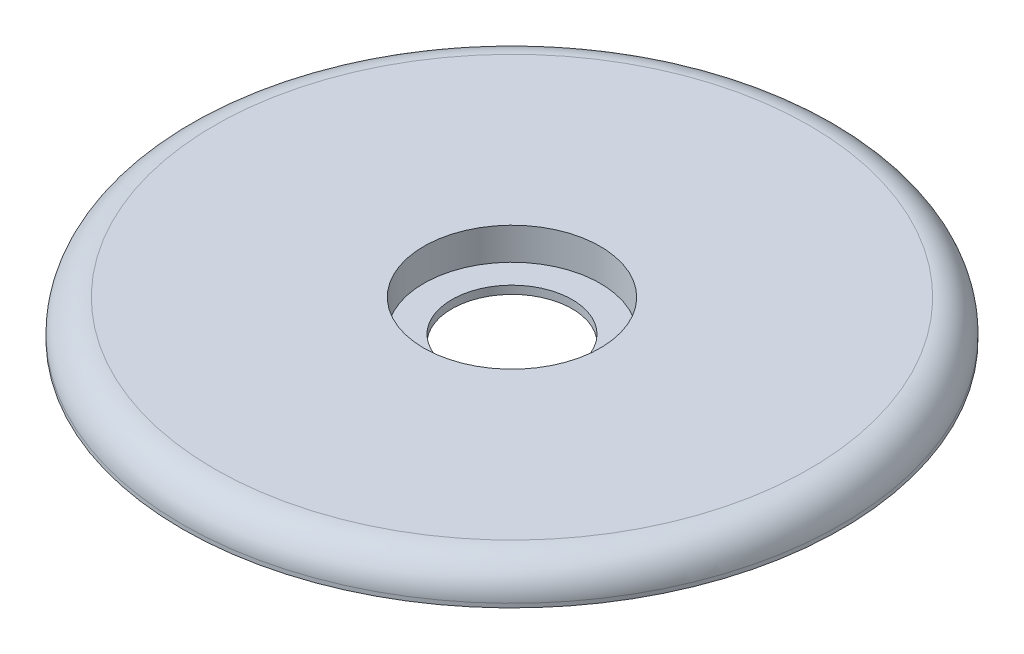
ISO-10303-21;
HEADER;
FILE_DESCRIPTION(('STEP AP214'),'2;1');
FILE_NAME('part.step','',(''),(''),'','','');
FILE_SCHEMA(('AUTOMOTIVE_DESIGN { 1 0 10303 214 1 1 1 1 }'));
ENDSEC;
DATA;
#1=APPLICATION_CONTEXT('core data for automotive mechanical design processes');
#2=APPLICATION_PROTOCOL_DEFINITION('international standard','automotive_design',2000,#1);
#3=PRODUCT_CONTEXT('',#1,'mechanical');
#4=PRODUCT('Part','Part','',(#3));
#5=PRODUCT_RELATED_PRODUCT_CATEGORY('part','',(#4));
#6=PRODUCT_DEFINITION_FORMATION('','',#4);
#7=PRODUCT_DEFINITION_CONTEXT('part definition',#1,'design');
#8=PRODUCT_DEFINITION('design','',#6,#7);
#9=PRODUCT_DEFINITION_SHAPE('','',#8);
#10=(LENGTH_UNIT() NAMED_UNIT(*) SI_UNIT(.MILLI.,.METRE.));
#11=(NAMED_UNIT(*) PLANE_ANGLE_UNIT() SI_UNIT($,.RADIAN.));
#12=(NAMED_UNIT(*) SI_UNIT($,.STERADIAN.) SOLID_ANGLE_UNIT());
#13=UNCERTAINTY_MEASURE_WITH_UNIT(LENGTH_MEASURE(1.E-05),#10,'distance_accuracy_value','');
#14=(GEOMETRIC_REPRESENTATION_CONTEXT(3) GLOBAL_UNCERTAINTY_ASSIGNED_CONTEXT((#13)) GLOBAL_UNIT_ASSIGNED_CONTEXT((#10,
#11,#12)) REPRESENTATION_CONTEXT('',''));
#15=CARTESIAN_POINT('',(0.,0.,0.));
#16=DIRECTION('',(0.,0.,1.));
#17=DIRECTION('',(1.,0.,0.));
#18=AXIS2_PLACEMENT_3D('',#15,#16,#17);
#19=CARTESIAN_POINT('',(0.,4.5,0.));
#20=DIRECTION('',(0.,-1.,0.));
#21=DIRECTION('',(0.,0.,-1.));
#22=AXIS2_PLACEMENT_3D('',#19,#20,#21);
#23=CYLINDRICAL_SURFACE('',#22,41.1);
#24=CARTESIAN_POINT('',(0.,0.5,0.));
#25=DIRECTION('',(0.,1.,0.));
#26=DIRECTION('',(0.,0.,1.));
#27=AXIS2_PLACEMENT_3D('',#24,#25,#26);
#28=CIRCLE('',#27,41.1);
#29=CARTESIAN_POINT('',(0.,0.5,41.1));
#30=VERTEX_POINT('',#29);
#31=EDGE_CURVE('E10',#30,#30,#28,.F.);
#32=ORIENTED_EDGE('',*,*,#31,.T.);
#33=EDGE_LOOP('',(#32));
#34=FACE_BOUND('',#33,.T.);
#35=CARTESIAN_POINT('',(0.,0.,0.));
#36=DIRECTION('',(0.,1.,0.));
#37=DIRECTION('',(0.,0.,1.));
#38=AXIS2_PLACEMENT_3D('',#35,#36,#37);
#39=CIRCLE('',#38,41.1);
#40=CARTESIAN_POINT('',(0.,0.,41.1));
#41=VERTEX_POINT('',#40);
#42=EDGE_CURVE('E53',#41,#41,#39,.T.);
#43=ORIENTED_EDGE('',*,*,#42,.T.);
#44=EDGE_LOOP('',(#43));
#45=FACE_BOUND('',#44,.T.);
#46=ADVANCED_FACE('F39',(#34,#45),#23,.T.);
#47=CARTESIAN_POINT('',(0.,4.5,0.));
#48=DIRECTION('',(0.,1.,0.));
#49=DIRECTION('',(0.,0.,1.));
#50=AXIS2_PLACEMENT_3D('',#47,#48,#49);
#51=PLANE('',#50);
#52=CARTESIAN_POINT('',(0.,4.5,0.));
#53=DIRECTION('',(0.,1.,0.));
#54=DIRECTION('',(0.,0.,1.));
#55=AXIS2_PLACEMENT_3D('',#52,#53,#54);
#56=CIRCLE('',#55,37.1);
#57=CARTESIAN_POINT('',(0.,4.5,37.1));
#58=VERTEX_POINT('',#57);
#59=EDGE_CURVE('E46',#58,#58,#56,.T.);
#60=ORIENTED_EDGE('',*,*,#59,.T.);
#61=EDGE_LOOP('',(#60));
#62=FACE_BOUND('',#61,.T.);
#63=CARTESIAN_POINT('',(0.,4.5,0.));
#64=DIRECTION('',(0.,1.,0.));
#65=DIRECTION('',(0.,0.,1.));
#66=AXIS2_PLACEMENT_3D('',#63,#64,#65);
#67=CIRCLE('',#66,11.);
#68=CARTESIAN_POINT('',(0.,4.5,11.));
#69=VERTEX_POINT('',#68);
#70=EDGE_CURVE('E62',#69,#69,#67,.T.);
#71=ORIENTED_EDGE('',*,*,#70,.F.);
#72=EDGE_LOOP('',(#71));
#73=FACE_BOUND('',#72,.T.);
#74=ADVANCED_FACE('F98',(#62,#73),#51,.T.);
#75=CARTESIAN_POINT('',(0.,0.,0.));
#76=DIRECTION('',(0.,1.,0.));
#77=DIRECTION('',(0.,0.,1.));
#78=AXIS2_PLACEMENT_3D('',#75,#76,#77);
#79=PLANE('',#78);
#80=CARTESIAN_POINT('',(0.,0.,0.));
#81=DIRECTION('',(0.,-1.,0.));
#82=DIRECTION('',(0.,0.,-1.));
#83=AXIS2_PLACEMENT_3D('',#80,#81,#82);
#84=CIRCLE('',#83,38.4);
#85=CARTESIAN_POINT('',(0.,0.,-38.4));
#86=VERTEX_POINT('',#85);
#87=EDGE_CURVE('E49',#86,#86,#84,.T.);
#88=ORIENTED_EDGE('',*,*,#87,.F.);
#89=EDGE_LOOP('',(#88));
#90=FACE_BOUND('',#89,.T.);
#91=ORIENTED_EDGE('',*,*,#42,.F.);
#92=EDGE_LOOP('',(#91));
#93=FACE_BOUND('',#92,.T.);
#94=ADVANCED_FACE('F96',(#90,#93),#79,.F.);
#95=CARTESIAN_POINT('',(0.,-0.5,0.));
#96=DIRECTION('',(0.,1.,0.));
#97=DIRECTION('',(0.,0.,1.));
#98=AXIS2_PLACEMENT_3D('',#95,#96,#97);
#99=CYLINDRICAL_SURFACE('',#98,38.4);
#100=CARTESIAN_POINT('',(0.,-0.5,0.));
#101=DIRECTION('',(0.,-1.,0.));
#102=DIRECTION('',(0.,0.,-1.));
#103=AXIS2_PLACEMENT_3D('',#100,#101,#102);
#104=CIRCLE('',#103,38.4);
#105=CARTESIAN_POINT('',(0.,-0.5,-38.4));
#106=VERTEX_POINT('',#105);
#107=EDGE_CURVE('E59',#106,#106,#104,.T.);
#108=ORIENTED_EDGE('',*,*,#107,.F.);
#109=EDGE_LOOP('',(#108));
#110=FACE_BOUND('',#109,.T.);
#111=ORIENTED_EDGE('',*,*,#87,.T.);
#112=EDGE_LOOP('',(#111));
#113=FACE_BOUND('',#112,.T.);
#114=ADVANCED_FACE('F102',(#110,#113),#99,.T.);
#115=CARTESIAN_POINT('',(0.,-0.5,0.));
#116=DIRECTION('',(0.,-1.,0.));
#117=DIRECTION('',(0.,0.,-1.));
#118=AXIS2_PLACEMENT_3D('',#115,#116,#117);
#119=PLANE('',#118);
#120=CARTESIAN_POINT('',(0.,-0.5,0.));
#121=DIRECTION('',(0.,1.,0.));
#122=DIRECTION('',(0.,0.,1.));
#123=AXIS2_PLACEMENT_3D('',#120,#121,#122);
#124=CIRCLE('',#123,7.5);
#125=CARTESIAN_POINT('',(0.,-0.5,7.5));
#126=VERTEX_POINT('',#125);
#127=EDGE_CURVE('E67',#126,#126,#124,.T.);
#128=ORIENTED_EDGE('',*,*,#127,.T.);
#129=EDGE_LOOP('',(#128));
#130=FACE_BOUND('',#129,.T.);
#131=ORIENTED_EDGE('',*,*,#107,.T.);
#132=EDGE_LOOP('',(#131));
#133=FACE_BOUND('',#132,.T.);
#134=ADVANCED_FACE('F73',(#130,#133),#119,.T.);
#135=CARTESIAN_POINT('',(0.,0.5,0.));
#136=DIRECTION('',(0.,1.,0.));
#137=DIRECTION('',(0.,0.,1.));
#138=AXIS2_PLACEMENT_3D('',#135,#136,#137);
#139=CYLINDRICAL_SURFACE('',#138,11.);
#140=CARTESIAN_POINT('',(0.,0.5,0.));
#141=DIRECTION('',(0.,1.,0.));
#142=DIRECTION('',(0.,0.,1.));
#143=AXIS2_PLACEMENT_3D('',#140,#141,#142);
#144=CIRCLE('',#143,11.);
#145=CARTESIAN_POINT('',(0.,0.5,11.));
#146=VERTEX_POINT('',#145);
#147=EDGE_CURVE('E65',#146,#146,#144,.T.);
#148=ORIENTED_EDGE('',*,*,#147,.F.);
#149=EDGE_LOOP('',(#148));
#150=FACE_BOUND('',#149,.T.);
#151=ORIENTED_EDGE('',*,*,#70,.T.);
#152=EDGE_LOOP('',(#151));
#153=FACE_BOUND('',#152,.T.);
#154=ADVANCED_FACE('F90',(#150,#153),#139,.F.);
#155=CARTESIAN_POINT('',(0.,0.5,0.));
#156=DIRECTION('',(0.,1.,0.));
#157=DIRECTION('',(0.,0.,1.));
#158=AXIS2_PLACEMENT_3D('',#155,#156,#157);
#159=PLANE('',#158);
#160=CARTESIAN_POINT('',(0.,0.5,0.));
#161=DIRECTION('',(0.,1.,0.));
#162=DIRECTION('',(0.,0.,1.));
#163=AXIS2_PLACEMENT_3D('',#160,#161,#162);
#164=CIRCLE('',#163,7.5);
#165=CARTESIAN_POINT('',(0.,0.5,7.5));
#166=VERTEX_POINT('',#165);
#167=EDGE_CURVE('E66',#166,#166,#164,.T.);
#168=ORIENTED_EDGE('',*,*,#167,.F.);
#169=EDGE_LOOP('',(#168));
#170=FACE_BOUND('',#169,.T.);
#171=ORIENTED_EDGE('',*,*,#147,.T.);
#172=EDGE_LOOP('',(#171));
#173=FACE_BOUND('',#172,.T.);
#174=ADVANCED_FACE('F81',(#170,#173),#159,.T.);
#175=CARTESIAN_POINT('',(0.,-0.5,0.));
#176=DIRECTION('',(0.,1.,0.));
#177=DIRECTION('',(0.,0.,1.));
#178=AXIS2_PLACEMENT_3D('',#175,#176,#177);
#179=CYLINDRICAL_SURFACE('',#178,7.5);
#180=ORIENTED_EDGE('',*,*,#127,.F.);
#181=EDGE_LOOP('',(#180));
#182=FACE_BOUND('',#181,.T.);
#183=ORIENTED_EDGE('',*,*,#167,.T.);
#184=EDGE_LOOP('',(#183));
#185=FACE_BOUND('',#184,.T.);
#186=ADVANCED_FACE('F76',(#182,#185),#179,.F.);
#187=CARTESIAN_POINT('',(0.,0.5,0.));
#188=DIRECTION('',(0.,1.,0.));
#189=DIRECTION('',(0.,0.,1.));
#190=AXIS2_PLACEMENT_3D('',#187,#188,#189);
#191=TOROIDAL_SURFACE('',#190,37.1,4.);
#192=ORIENTED_EDGE('',*,*,#31,.F.);
#193=EDGE_LOOP('',(#192));
#194=FACE_BOUND('',#193,.T.);
#195=ORIENTED_EDGE('',*,*,#59,.F.);
#196=EDGE_LOOP('',(#195));
#197=FACE_BOUND('',#196,.T.);
#198=ADVANCED_FACE('F41',(#194,#197),#191,.T.);
#199=CLOSED_SHELL('',(#46,#74,#94,#114,#134,#154,#174,#186,#198));
#200=MANIFOLD_SOLID_BREP('B2',#199);
#201=ADVANCED_BREP_SHAPE_REPRESENTATION('',(#18,#200),#14);
#202=SHAPE_DEFINITION_REPRESENTATION(#9,#201);
ENDSEC;
END-ISO-10303-21;
